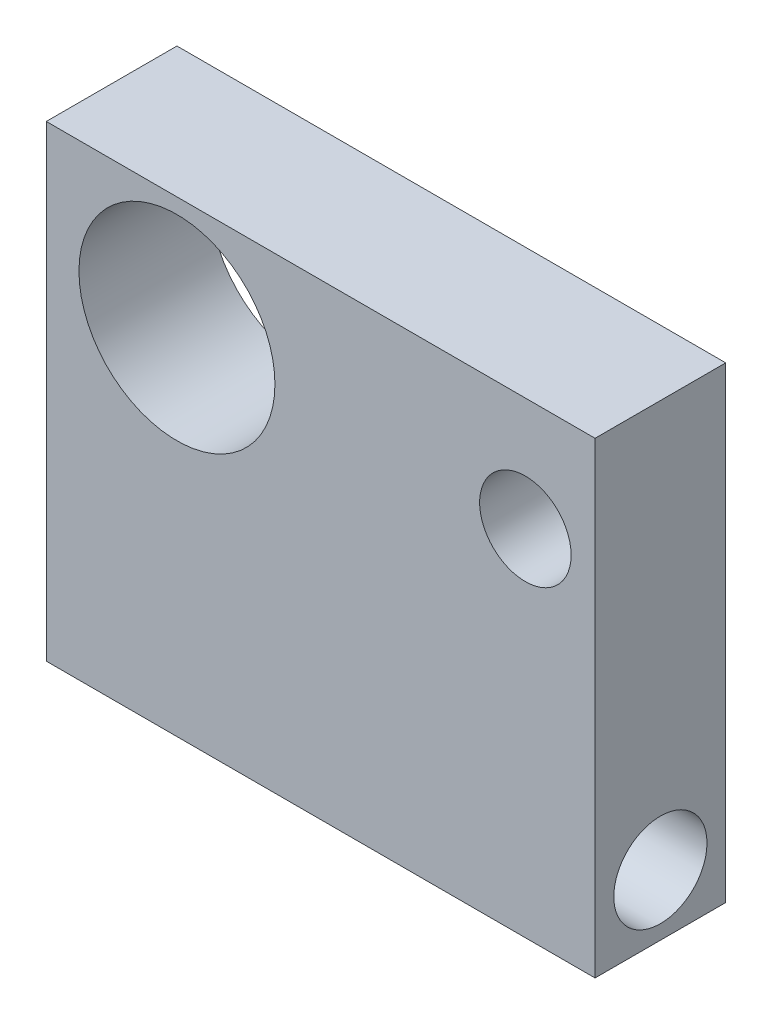
ISO-10303-21;
HEADER;
FILE_DESCRIPTION(('STEP AP214'),'2;1');
FILE_NAME('part.step','',(''),(''),'','','');
FILE_SCHEMA(('AUTOMOTIVE_DESIGN { 1 0 10303 214 1 1 1 1 }'));
ENDSEC;
DATA;
#1=APPLICATION_CONTEXT('core data for automotive mechanical design processes');
#2=APPLICATION_PROTOCOL_DEFINITION('international standard','automotive_design',2000,#1);
#3=PRODUCT_CONTEXT('',#1,'mechanical');
#4=PRODUCT('Part','Part','',(#3));
#5=PRODUCT_RELATED_PRODUCT_CATEGORY('part','',(#4));
#6=PRODUCT_DEFINITION_FORMATION('','',#4);
#7=PRODUCT_DEFINITION_CONTEXT('part definition',#1,'design');
#8=PRODUCT_DEFINITION('design','',#6,#7);
#9=PRODUCT_DEFINITION_SHAPE('','',#8);
#10=(LENGTH_UNIT() NAMED_UNIT(*) SI_UNIT(.MILLI.,.METRE.));
#11=(NAMED_UNIT(*) PLANE_ANGLE_UNIT() SI_UNIT($,.RADIAN.));
#12=(NAMED_UNIT(*) SI_UNIT($,.STERADIAN.) SOLID_ANGLE_UNIT());
#13=UNCERTAINTY_MEASURE_WITH_UNIT(LENGTH_MEASURE(1.E-05),#10,'distance_accuracy_value','');
#14=(GEOMETRIC_REPRESENTATION_CONTEXT(3) GLOBAL_UNCERTAINTY_ASSIGNED_CONTEXT((#13)) GLOBAL_UNIT_ASSIGNED_CONTEXT((#10,
#11,#12)) REPRESENTATION_CONTEXT('',''));
#15=CARTESIAN_POINT('',(0.,0.,0.));
#16=DIRECTION('',(0.,0.,1.));
#17=DIRECTION('',(1.,0.,0.));
#18=AXIS2_PLACEMENT_3D('',#15,#16,#17);
#19=CARTESIAN_POINT('',(0.,0.,15.));
#20=DIRECTION('',(0.,0.,-1.));
#21=DIRECTION('',(-1.,0.,0.));
#22=AXIS2_PLACEMENT_3D('',#19,#20,#21);
#23=PLANE('',#22);
#24=DIRECTION('',(0.,1.,0.));
#25=VECTOR('',#24,1.);
#26=CARTESIAN_POINT('',(31.0562179808576,-27.2079895737648,15.));
#27=LINE('',#26,#25);
#28=CARTESIAN_POINT('',(31.0562179808576,-27.2079895737648,15.));
#29=VERTEX_POINT('',#28);
#30=CARTESIAN_POINT('',(31.0562179808576,26.4520104262352,15.));
#31=VERTEX_POINT('',#30);
#32=EDGE_CURVE('E92',#29,#31,#27,.T.);
#33=ORIENTED_EDGE('',*,*,#32,.T.);
#34=DIRECTION('',(-1.,0.,0.));
#35=VECTOR('',#34,1.);
#36=CARTESIAN_POINT('',(-31.9437820191424,26.4520104262352,15.));
#37=LINE('',#36,#35);
#38=CARTESIAN_POINT('',(-31.9437820191424,26.4520104262352,15.));
#39=VERTEX_POINT('',#38);
#40=EDGE_CURVE('E87',#31,#39,#37,.T.);
#41=ORIENTED_EDGE('',*,*,#40,.T.);
#42=DIRECTION('',(0.,-1.,0.));
#43=VECTOR('',#42,1.);
#44=CARTESIAN_POINT('',(-31.9437820191424,-27.2079895737648,15.));
#45=LINE('',#44,#43);
#46=CARTESIAN_POINT('',(-31.9437820191424,-27.2079895737648,15.));
#47=VERTEX_POINT('',#46);
#48=EDGE_CURVE('E90',#39,#47,#45,.T.);
#49=ORIENTED_EDGE('',*,*,#48,.T.);
#50=DIRECTION('',(1.,0.,0.));
#51=VECTOR('',#50,1.);
#52=CARTESIAN_POINT('',(-31.9437820191424,-27.2079895737648,15.));
#53=LINE('',#52,#51);
#54=EDGE_CURVE('E57',#47,#29,#53,.T.);
#55=ORIENTED_EDGE('',*,*,#54,.T.);
#56=EDGE_LOOP('',(#33,#41,#49,#55));
#57=FACE_BOUND('',#56,.T.);
#58=CARTESIAN_POINT('',(23.0562179808576,13.4520104262352,15.));
#59=DIRECTION('',(0.,0.,1.));
#60=DIRECTION('',(1.,0.,0.));
#61=AXIS2_PLACEMENT_3D('',#58,#59,#60);
#62=CIRCLE('',#61,5.25);
#63=CARTESIAN_POINT('',(28.3062179808576,13.4520104262352,15.));
#64=VERTEX_POINT('',#63);
#65=EDGE_CURVE('E112',#64,#64,#62,.T.);
#66=ORIENTED_EDGE('',*,*,#65,.F.);
#67=EDGE_LOOP('',(#66));
#68=FACE_BOUND('',#67,.T.);
#69=CARTESIAN_POINT('',(-16.9437820191424,13.4520104262352,15.));
#70=DIRECTION('',(0.,0.,1.));
#71=DIRECTION('',(1.,0.,0.));
#72=AXIS2_PLACEMENT_3D('',#69,#70,#71);
#73=CIRCLE('',#72,11.25);
#74=CARTESIAN_POINT('',(-5.69378201914241,13.4520104262352,15.));
#75=VERTEX_POINT('',#74);
#76=EDGE_CURVE('E134',#75,#75,#73,.T.);
#77=ORIENTED_EDGE('',*,*,#76,.F.);
#78=EDGE_LOOP('',(#77));
#79=FACE_BOUND('',#78,.T.);
#80=ADVANCED_FACE('F39',(#57,#68,#79),#23,.F.);
#81=CARTESIAN_POINT('',(0.,0.,0.));
#82=DIRECTION('',(0.,0.,-1.));
#83=DIRECTION('',(-1.,0.,0.));
#84=AXIS2_PLACEMENT_3D('',#81,#82,#83);
#85=PLANE('',#84);
#86=CARTESIAN_POINT('',(23.0562179808576,13.4520104262352,0.));
#87=DIRECTION('',(0.,0.,1.));
#88=DIRECTION('',(1.,0.,0.));
#89=AXIS2_PLACEMENT_3D('',#86,#87,#88);
#90=CIRCLE('',#89,5.25);
#91=CARTESIAN_POINT('',(28.3062179808576,13.4520104262352,0.));
#92=VERTEX_POINT('',#91);
#93=EDGE_CURVE('E130',#92,#92,#90,.T.);
#94=ORIENTED_EDGE('',*,*,#93,.T.);
#95=EDGE_LOOP('',(#94));
#96=FACE_BOUND('',#95,.T.);
#97=DIRECTION('',(0.,1.,0.));
#98=VECTOR('',#97,1.);
#99=CARTESIAN_POINT('',(31.0562179808576,-27.2079895737648,0.));
#100=LINE('',#99,#98);
#101=CARTESIAN_POINT('',(31.0562179808576,-27.2079895737648,0.));
#102=VERTEX_POINT('',#101);
#103=CARTESIAN_POINT('',(31.0562179808576,26.4520104262352,0.));
#104=VERTEX_POINT('',#103);
#105=EDGE_CURVE('E108',#102,#104,#100,.T.);
#106=ORIENTED_EDGE('',*,*,#105,.F.);
#107=DIRECTION('',(1.,0.,0.));
#108=VECTOR('',#107,1.);
#109=CARTESIAN_POINT('',(-31.9437820191424,-27.2079895737648,0.));
#110=LINE('',#109,#108);
#111=CARTESIAN_POINT('',(-31.9437820191424,-27.2079895737648,0.));
#112=VERTEX_POINT('',#111);
#113=EDGE_CURVE('E80',#112,#102,#110,.T.);
#114=ORIENTED_EDGE('',*,*,#113,.F.);
#115=DIRECTION('',(0.,-1.,0.));
#116=VECTOR('',#115,1.);
#117=CARTESIAN_POINT('',(-31.9437820191424,-27.2079895737648,0.));
#118=LINE('',#117,#116);
#119=CARTESIAN_POINT('',(-31.9437820191424,26.4520104262352,0.));
#120=VERTEX_POINT('',#119);
#121=EDGE_CURVE('E74',#120,#112,#118,.T.);
#122=ORIENTED_EDGE('',*,*,#121,.F.);
#123=DIRECTION('',(-1.,0.,0.));
#124=VECTOR('',#123,1.);
#125=CARTESIAN_POINT('',(-31.9437820191424,26.4520104262352,0.));
#126=LINE('',#125,#124);
#127=EDGE_CURVE('E97',#104,#120,#126,.T.);
#128=ORIENTED_EDGE('',*,*,#127,.F.);
#129=EDGE_LOOP('',(#106,#114,#122,#128));
#130=FACE_BOUND('',#129,.T.);
#131=CARTESIAN_POINT('',(-16.9437820191424,13.4520104262352,0.));
#132=DIRECTION('',(0.,0.,1.));
#133=DIRECTION('',(1.,0.,0.));
#134=AXIS2_PLACEMENT_3D('',#131,#132,#133);
#135=CIRCLE('',#134,11.25);
#136=CARTESIAN_POINT('',(-5.69378201914241,13.4520104262352,0.));
#137=VERTEX_POINT('',#136);
#138=EDGE_CURVE('E138',#137,#137,#135,.T.);
#139=ORIENTED_EDGE('',*,*,#138,.T.);
#140=EDGE_LOOP('',(#139));
#141=FACE_BOUND('',#140,.T.);
#142=ADVANCED_FACE('F125',(#96,#130,#141),#85,.T.);
#143=CARTESIAN_POINT('',(31.0562179808576,-27.2079895737648,15.));
#144=DIRECTION('',(-1.,0.,0.));
#145=DIRECTION('',(0.,0.,1.));
#146=AXIS2_PLACEMENT_3D('',#143,#144,#145);
#147=PLANE('',#146);
#148=CARTESIAN_POINT('',(31.0562179808576,-20.2079895737648,7.5));
#149=DIRECTION('',(1.,0.,0.));
#150=DIRECTION('',(0.,0.,-1.));
#151=AXIS2_PLACEMENT_3D('',#148,#149,#150);
#152=CIRCLE('',#151,5.35);
#153=CARTESIAN_POINT('',(31.0562179808576,-20.2079895737648,2.15));
#154=VERTEX_POINT('',#153);
#155=EDGE_CURVE('E146',#154,#154,#152,.T.);
#156=ORIENTED_EDGE('',*,*,#155,.F.);
#157=EDGE_LOOP('',(#156));
#158=FACE_BOUND('',#157,.T.);
#159=ORIENTED_EDGE('',*,*,#105,.T.);
#160=DIRECTION('',(0.,0.,-1.));
#161=VECTOR('',#160,1.);
#162=CARTESIAN_POINT('',(31.0562179808576,26.4520104262352,15.));
#163=LINE('',#162,#161);
#164=EDGE_CURVE('E11',#31,#104,#163,.T.);
#165=ORIENTED_EDGE('',*,*,#164,.F.);
#166=ORIENTED_EDGE('',*,*,#32,.F.);
#167=DIRECTION('',(0.,0.,-1.));
#168=VECTOR('',#167,1.);
#169=CARTESIAN_POINT('',(31.0562179808576,-27.2079895737648,15.));
#170=LINE('',#169,#168);
#171=EDGE_CURVE('E104',#29,#102,#170,.T.);
#172=ORIENTED_EDGE('',*,*,#171,.T.);
#173=EDGE_LOOP('',(#159,#165,#166,#172));
#174=FACE_BOUND('',#173,.T.);
#175=ADVANCED_FACE('F41',(#158,#174),#147,.F.);
#176=CARTESIAN_POINT('',(-31.9437820191424,26.4520104262352,15.));
#177=DIRECTION('',(0.,-1.,0.));
#178=DIRECTION('',(0.,0.,-1.));
#179=AXIS2_PLACEMENT_3D('',#176,#177,#178);
#180=PLANE('',#179);
#181=ORIENTED_EDGE('',*,*,#127,.T.);
#182=DIRECTION('',(0.,0.,-1.));
#183=VECTOR('',#182,1.);
#184=CARTESIAN_POINT('',(-31.9437820191424,26.4520104262352,15.));
#185=LINE('',#184,#183);
#186=EDGE_CURVE('E49',#39,#120,#185,.T.);
#187=ORIENTED_EDGE('',*,*,#186,.F.);
#188=ORIENTED_EDGE('',*,*,#40,.F.);
#189=ORIENTED_EDGE('',*,*,#164,.T.);
#190=EDGE_LOOP('',(#181,#187,#188,#189));
#191=FACE_BOUND('',#190,.T.);
#192=ADVANCED_FACE('F96',(#191),#180,.F.);
#193=CARTESIAN_POINT('',(-31.9437820191424,-27.2079895737648,15.));
#194=DIRECTION('',(1.,0.,0.));
#195=DIRECTION('',(0.,0.,-1.));
#196=AXIS2_PLACEMENT_3D('',#193,#194,#195);
#197=PLANE('',#196);
#198=CARTESIAN_POINT('',(-31.9437820191424,-20.2079895737648,7.5));
#199=DIRECTION('',(1.,0.,0.));
#200=DIRECTION('',(0.,0.,-1.));
#201=AXIS2_PLACEMENT_3D('',#198,#199,#200);
#202=CIRCLE('',#201,5.35);
#203=CARTESIAN_POINT('',(-31.9437820191424,-20.2079895737648,2.15));
#204=VERTEX_POINT('',#203);
#205=EDGE_CURVE('E142',#204,#204,#202,.T.);
#206=ORIENTED_EDGE('',*,*,#205,.T.);
#207=EDGE_LOOP('',(#206));
#208=FACE_BOUND('',#207,.T.);
#209=ORIENTED_EDGE('',*,*,#121,.T.);
#210=DIRECTION('',(0.,0.,-1.));
#211=VECTOR('',#210,1.);
#212=CARTESIAN_POINT('',(-31.9437820191424,-27.2079895737648,15.));
#213=LINE('',#212,#211);
#214=EDGE_CURVE('E99',#47,#112,#213,.T.);
#215=ORIENTED_EDGE('',*,*,#214,.F.);
#216=ORIENTED_EDGE('',*,*,#48,.F.);
#217=ORIENTED_EDGE('',*,*,#186,.T.);
#218=EDGE_LOOP('',(#209,#215,#216,#217));
#219=FACE_BOUND('',#218,.T.);
#220=ADVANCED_FACE('F100',(#208,#219),#197,.F.);
#221=CARTESIAN_POINT('',(-31.9437820191424,-27.2079895737648,15.));
#222=DIRECTION('',(0.,1.,0.));
#223=DIRECTION('',(0.,0.,1.));
#224=AXIS2_PLACEMENT_3D('',#221,#222,#223);
#225=PLANE('',#224);
#226=ORIENTED_EDGE('',*,*,#113,.T.);
#227=ORIENTED_EDGE('',*,*,#171,.F.);
#228=ORIENTED_EDGE('',*,*,#54,.F.);
#229=ORIENTED_EDGE('',*,*,#214,.T.);
#230=EDGE_LOOP('',(#226,#227,#228,#229));
#231=FACE_BOUND('',#230,.T.);
#232=ADVANCED_FACE('F122',(#231),#225,.F.);
#233=CARTESIAN_POINT('',(23.0562179808576,13.4520104262352,15.));
#234=DIRECTION('',(0.,0.,-1.));
#235=DIRECTION('',(-1.,0.,0.));
#236=AXIS2_PLACEMENT_3D('',#233,#234,#235);
#237=CYLINDRICAL_SURFACE('',#236,5.25);
#238=ORIENTED_EDGE('',*,*,#65,.T.);
#239=EDGE_LOOP('',(#238));
#240=FACE_BOUND('',#239,.T.);
#241=ORIENTED_EDGE('',*,*,#93,.F.);
#242=EDGE_LOOP('',(#241));
#243=FACE_BOUND('',#242,.T.);
#244=ADVANCED_FACE('F174',(#240,#243),#237,.F.);
#245=CARTESIAN_POINT('',(-16.9437820191424,13.4520104262352,15.));
#246=DIRECTION('',(0.,0.,-1.));
#247=DIRECTION('',(-1.,0.,0.));
#248=AXIS2_PLACEMENT_3D('',#245,#246,#247);
#249=CYLINDRICAL_SURFACE('',#248,11.25);
#250=ORIENTED_EDGE('',*,*,#76,.T.);
#251=EDGE_LOOP('',(#250));
#252=FACE_BOUND('',#251,.T.);
#253=ORIENTED_EDGE('',*,*,#138,.F.);
#254=EDGE_LOOP('',(#253));
#255=FACE_BOUND('',#254,.T.);
#256=ADVANCED_FACE('F158',(#252,#255),#249,.F.);
#257=CARTESIAN_POINT('',(-31.9437820191424,-20.2079895737648,7.5));
#258=DIRECTION('',(1.,0.,0.));
#259=DIRECTION('',(0.,0.,-1.));
#260=AXIS2_PLACEMENT_3D('',#257,#258,#259);
#261=CYLINDRICAL_SURFACE('',#260,5.35);
#262=ORIENTED_EDGE('',*,*,#205,.F.);
#263=EDGE_LOOP('',(#262));
#264=FACE_BOUND('',#263,.T.);
#265=ORIENTED_EDGE('',*,*,#155,.T.);
#266=EDGE_LOOP('',(#265));
#267=FACE_BOUND('',#266,.T.);
#268=ADVANCED_FACE('F155',(#264,#267),#261,.F.);
#269=CLOSED_SHELL('',(#80,#142,#175,#192,#220,#232,#244,#256,#268));
#270=MANIFOLD_SOLID_BREP('B2',#269);
#271=ADVANCED_BREP_SHAPE_REPRESENTATION('',(#18,#270),#14);
#272=SHAPE_DEFINITION_REPRESENTATION(#9,#271);
ENDSEC;
END-ISO-10303-21;
